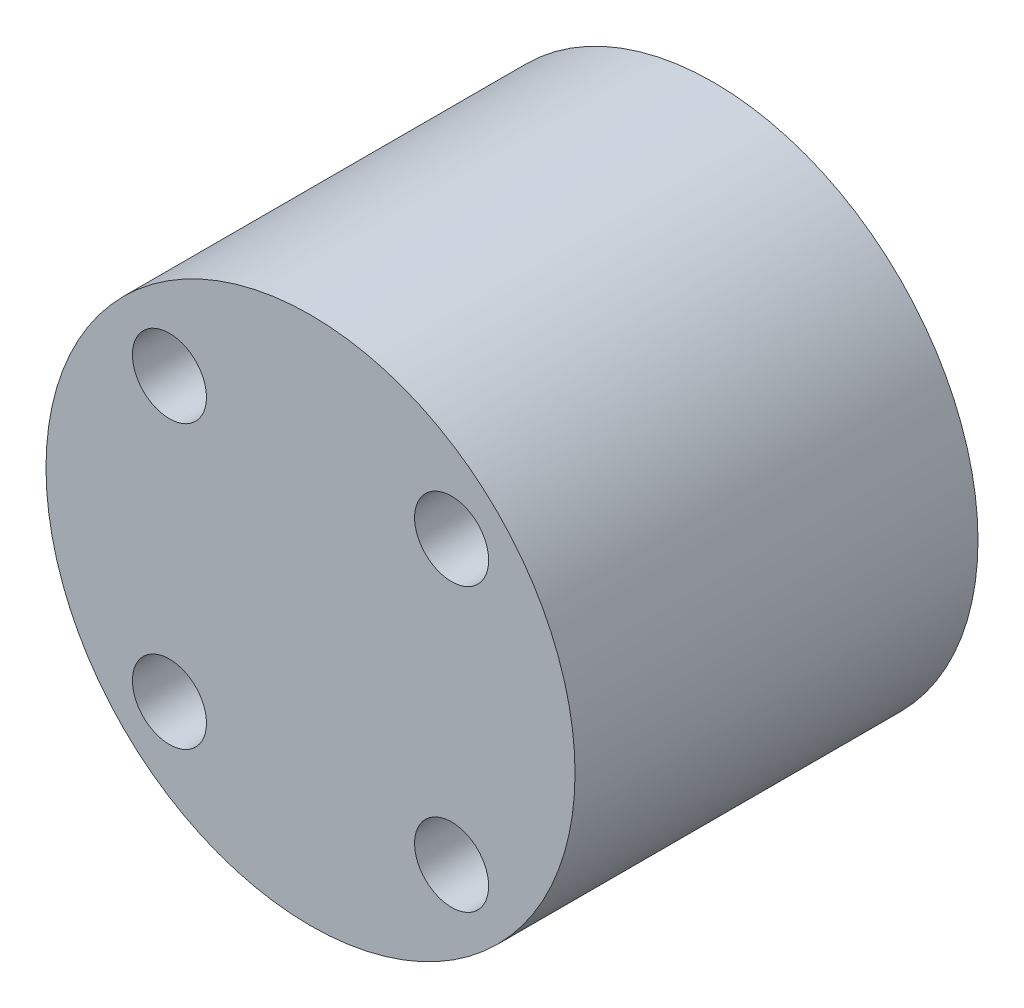
ISO-10303-21;
HEADER;
FILE_DESCRIPTION(('STEP AP214'),'2;1');
FILE_NAME('part.step','',(''),(''),'','','');
FILE_SCHEMA(('AUTOMOTIVE_DESIGN { 1 0 10303 214 1 1 1 1 }'));
ENDSEC;
DATA;
#1=APPLICATION_CONTEXT('core data for automotive mechanical design processes');
#2=APPLICATION_PROTOCOL_DEFINITION('international standard','automotive_design',2000,#1);
#3=PRODUCT_CONTEXT('',#1,'mechanical');
#4=PRODUCT('Part','Part','',(#3));
#5=PRODUCT_RELATED_PRODUCT_CATEGORY('part','',(#4));
#6=PRODUCT_DEFINITION_FORMATION('','',#4);
#7=PRODUCT_DEFINITION_CONTEXT('part definition',#1,'design');
#8=PRODUCT_DEFINITION('design','',#6,#7);
#9=PRODUCT_DEFINITION_SHAPE('','',#8);
#10=(LENGTH_UNIT() NAMED_UNIT(*) SI_UNIT(.MILLI.,.METRE.));
#11=(NAMED_UNIT(*) PLANE_ANGLE_UNIT() SI_UNIT($,.RADIAN.));
#12=(NAMED_UNIT(*) SI_UNIT($,.STERADIAN.) SOLID_ANGLE_UNIT());
#13=UNCERTAINTY_MEASURE_WITH_UNIT(LENGTH_MEASURE(1.E-05),#10,'distance_accuracy_value','');
#14=(GEOMETRIC_REPRESENTATION_CONTEXT(3) GLOBAL_UNCERTAINTY_ASSIGNED_CONTEXT((#13)) GLOBAL_UNIT_ASSIGNED_CONTEXT((#10,
#11,#12)) REPRESENTATION_CONTEXT('',''));
#15=CARTESIAN_POINT('',(0.,0.,0.));
#16=DIRECTION('',(0.,0.,1.));
#17=DIRECTION('',(1.,0.,0.));
#18=AXIS2_PLACEMENT_3D('',#15,#16,#17);
#19=CARTESIAN_POINT('',(0.,0.,11.425));
#20=DIRECTION('',(0.,0.,-1.));
#21=DIRECTION('',(-1.,0.,0.));
#22=AXIS2_PLACEMENT_3D('',#19,#20,#21);
#23=CYLINDRICAL_SURFACE('',#22,15.);
#24=CARTESIAN_POINT('',(0.,0.,11.425));
#25=DIRECTION('',(0.,0.,1.));
#26=DIRECTION('',(1.,0.,0.));
#27=AXIS2_PLACEMENT_3D('',#24,#25,#26);
#28=CIRCLE('',#27,15.);
#29=CARTESIAN_POINT('',(-15.,0.,11.425));
#30=VERTEX_POINT('',#29);
#31=EDGE_CURVE('E10',#30,#30,#28,.T.);
#32=CARTESIAN_POINT('',(0.,0.,-11.425));
#33=DIRECTION('',(0.,0.,1.));
#34=DIRECTION('',(1.,0.,0.));
#35=AXIS2_PLACEMENT_3D('',#32,#33,#34);
#36=CIRCLE('',#35,15.);
#37=CARTESIAN_POINT('',(-15.,0.,-11.425));
#38=VERTEX_POINT('',#37);
#39=EDGE_CURVE('E37',#38,#38,#36,.T.);
#40=CARTESIAN_POINT('',(-15.,0.,11.425));
#41=CARTESIAN_POINT('',(-15.,0.,11.1869791666667));
#42=CARTESIAN_POINT('',(-15.,0.,10.9489583333333));
#43=CARTESIAN_POINT('',(-15.,0.,10.4729166666667));
#44=CARTESIAN_POINT('',(-15.,0.,10.2348958333333));
#45=CARTESIAN_POINT('',(-15.,0.,9.75885416666667));
#46=CARTESIAN_POINT('',(-15.,0.,9.52083333333333));
#47=CARTESIAN_POINT('',(-15.,0.,9.04479166666667));
#48=CARTESIAN_POINT('',(-15.,0.,8.80677083333333));
#49=CARTESIAN_POINT('',(-15.,0.,8.33072916666667));
#50=CARTESIAN_POINT('',(-15.,0.,8.09270833333333));
#51=CARTESIAN_POINT('',(-15.,0.,7.61666666666667));
#52=CARTESIAN_POINT('',(-15.,0.,7.37864583333333));
#53=CARTESIAN_POINT('',(-15.,0.,6.90260416666667));
#54=CARTESIAN_POINT('',(-15.,0.,6.66458333333333));
#55=CARTESIAN_POINT('',(-15.,0.,6.18854166666667));
#56=CARTESIAN_POINT('',(-15.,0.,5.95052083333333));
#57=CARTESIAN_POINT('',(-15.,0.,5.47447916666667));
#58=CARTESIAN_POINT('',(-15.,0.,5.23645833333333));
#59=CARTESIAN_POINT('',(-15.,0.,4.76041666666667));
#60=CARTESIAN_POINT('',(-15.,0.,4.52239583333333));
#61=CARTESIAN_POINT('',(-15.,0.,4.04635416666667));
#62=CARTESIAN_POINT('',(-15.,0.,3.80833333333333));
#63=CARTESIAN_POINT('',(-15.,0.,3.33229166666667));
#64=CARTESIAN_POINT('',(-15.,0.,3.09427083333333));
#65=CARTESIAN_POINT('',(-15.,0.,2.61822916666666));
#66=CARTESIAN_POINT('',(-15.,0.,2.38020833333333));
#67=CARTESIAN_POINT('',(-15.,0.,1.90416666666666));
#68=CARTESIAN_POINT('',(-15.,0.,1.66614583333333));
#69=CARTESIAN_POINT('',(-15.,0.,1.19010416666666));
#70=CARTESIAN_POINT('',(-15.,0.,0.952083333333331));
#71=CARTESIAN_POINT('',(-15.,0.,0.476041666666664));
#72=CARTESIAN_POINT('',(-15.,0.,0.23802083333333));
#73=CARTESIAN_POINT('',(-15.,0.,-0.238020833333337));
#74=CARTESIAN_POINT('',(-15.,0.,-0.476041666666671));
#75=CARTESIAN_POINT('',(-15.,0.,-0.952083333333338));
#76=CARTESIAN_POINT('',(-15.,0.,-1.19010416666667));
#77=CARTESIAN_POINT('',(-15.,0.,-1.66614583333334));
#78=CARTESIAN_POINT('',(-15.,0.,-1.90416666666667));
#79=CARTESIAN_POINT('',(-15.,0.,-2.38020833333334));
#80=CARTESIAN_POINT('',(-15.,0.,-2.61822916666667));
#81=CARTESIAN_POINT('',(-15.,0.,-3.09427083333334));
#82=CARTESIAN_POINT('',(-15.,0.,-3.33229166666667));
#83=CARTESIAN_POINT('',(-15.,0.,-3.80833333333334));
#84=CARTESIAN_POINT('',(-15.,0.,-4.04635416666667));
#85=CARTESIAN_POINT('',(-15.,0.,-4.52239583333333));
#86=CARTESIAN_POINT('',(-15.,0.,-4.76041666666667));
#87=CARTESIAN_POINT('',(-15.,0.,-5.23645833333333));
#88=CARTESIAN_POINT('',(-15.,0.,-5.47447916666667));
#89=CARTESIAN_POINT('',(-15.,0.,-5.95052083333334));
#90=CARTESIAN_POINT('',(-15.,0.,-6.18854166666667));
#91=CARTESIAN_POINT('',(-15.,0.,-6.66458333333334));
#92=CARTESIAN_POINT('',(-15.,0.,-6.90260416666667));
#93=CARTESIAN_POINT('',(-15.,0.,-7.37864583333334));
#94=CARTESIAN_POINT('',(-15.,0.,-7.61666666666667));
#95=CARTESIAN_POINT('',(-15.,0.,-8.09270833333334));
#96=CARTESIAN_POINT('',(-15.,0.,-8.33072916666667));
#97=CARTESIAN_POINT('',(-15.,0.,-8.80677083333334));
#98=CARTESIAN_POINT('',(-15.,0.,-9.04479166666667));
#99=CARTESIAN_POINT('',(-15.,0.,-9.52083333333334));
#100=CARTESIAN_POINT('',(-15.,0.,-9.75885416666667));
#101=CARTESIAN_POINT('',(-15.,0.,-10.2348958333333));
#102=CARTESIAN_POINT('',(-15.,0.,-10.4729166666667));
#103=CARTESIAN_POINT('',(-15.,0.,-10.9489583333333));
#104=CARTESIAN_POINT('',(-15.,0.,-11.1869791666667));
#105=CARTESIAN_POINT('',(-15.,0.,-11.425));
#106=B_SPLINE_CURVE_WITH_KNOTS('',3,(#40,#41,#42,#43,#44,#45,#46,#47,#48,#49,#50,#51,#52,#53,
#54,#55,#56,#57,#58,#59,#60,#61,#62,#63,#64,#65,#66,#67,#68,#69,#70,#71,#72,#73,#74,#75,#76,#77,
#78,#79,#80,#81,#82,#83,#84,#85,#86,#87,#88,#89,#90,#91,#92,#93,#94,#95,#96,#97,#98,#99,#100,
#101,#102,#103,#104,#105),.UNSPECIFIED.,.F.,.F.,(4,2,2,2,2,2,2,2,2,2,2,2,2,2,2,2,2,2,2,2,2,2,2,
2,2,2,2,2,2,2,2,2,4),(0.,0.714062499999999,1.428125,2.1421875,2.85625,3.5703125,4.284375,
4.9984375,5.7125,6.4265625,7.140625,7.8546875,8.56875,9.2828125,9.996875,10.7109375,11.425,
12.1390625,12.853125,13.5671875,14.28125,14.9953125,15.709375,16.4234375,17.1375,17.8515625,
18.565625,19.2796875,19.99375,20.7078125,21.421875,22.1359375,22.85),.UNSPECIFIED.);
#107=EDGE_CURVE('BSEAM40',#30,#38,#106,.T.);
#108=ORIENTED_EDGE('',*,*,#31,.F.);
#109=ORIENTED_EDGE('',*,*,#39,.T.);
#110=ORIENTED_EDGE('',*,*,#107,.T.);
#111=ORIENTED_EDGE('',*,*,#107,.F.);
#112=EDGE_LOOP('',(#108,#110,#109,#111));
#113=FACE_BOUND('',#112,.T.);
#114=ADVANCED_FACE('F40',(#113),#23,.T.);
#115=CARTESIAN_POINT('',(0.,0.,11.425));
#116=DIRECTION('',(0.,0.,1.));
#117=DIRECTION('',(1.,0.,0.));
#118=AXIS2_PLACEMENT_3D('',#115,#116,#117);
#119=PLANE('',#118);
#120=CARTESIAN_POINT('',(-8.,-8.,11.425));
#121=DIRECTION('',(0.,0.,1.));
#122=DIRECTION('',(1.,0.,0.));
#123=AXIS2_PLACEMENT_3D('',#120,#121,#122);
#124=CIRCLE('',#123,2.1);
#125=CARTESIAN_POINT('',(-5.9,-8.,11.425));
#126=VERTEX_POINT('',#125);
#127=EDGE_CURVE('E59',#126,#126,#124,.T.);
#128=ORIENTED_EDGE('',*,*,#127,.F.);
#129=EDGE_LOOP('',(#128));
#130=FACE_BOUND('',#129,.T.);
#131=CARTESIAN_POINT('',(8.,-8.,11.425));
#132=DIRECTION('',(0.,0.,1.));
#133=DIRECTION('',(1.,0.,0.));
#134=AXIS2_PLACEMENT_3D('',#131,#132,#133);
#135=CIRCLE('',#134,2.1);
#136=CARTESIAN_POINT('',(10.1,-8.,11.425));
#137=VERTEX_POINT('',#136);
#138=EDGE_CURVE('E61',#137,#137,#135,.T.);
#139=ORIENTED_EDGE('',*,*,#138,.F.);
#140=EDGE_LOOP('',(#139));
#141=FACE_BOUND('',#140,.T.);
#142=CARTESIAN_POINT('',(8.,8.,11.425));
#143=DIRECTION('',(0.,0.,1.));
#144=DIRECTION('',(1.,0.,0.));
#145=AXIS2_PLACEMENT_3D('',#142,#143,#144);
#146=CIRCLE('',#145,2.1);
#147=CARTESIAN_POINT('',(10.1,8.,11.425));
#148=VERTEX_POINT('',#147);
#149=EDGE_CURVE('E55',#148,#148,#146,.T.);
#150=ORIENTED_EDGE('',*,*,#149,.F.);
#151=EDGE_LOOP('',(#150));
#152=FACE_BOUND('',#151,.T.);
#153=CARTESIAN_POINT('',(-8.,8.,11.425));
#154=DIRECTION('',(0.,0.,1.));
#155=DIRECTION('',(1.,0.,0.));
#156=AXIS2_PLACEMENT_3D('',#153,#154,#155);
#157=CIRCLE('',#156,2.1);
#158=CARTESIAN_POINT('',(-5.9,8.,11.425));
#159=VERTEX_POINT('',#158);
#160=EDGE_CURVE('E47',#159,#159,#157,.T.);
#161=ORIENTED_EDGE('',*,*,#160,.F.);
#162=EDGE_LOOP('',(#161));
#163=FACE_BOUND('',#162,.T.);
#164=ORIENTED_EDGE('',*,*,#31,.T.);
#165=EDGE_LOOP('',(#164));
#166=FACE_BOUND('',#165,.T.);
#167=ADVANCED_FACE('F73',(#130,#141,#152,#163,#166),#119,.T.);
#168=CARTESIAN_POINT('',(0.,0.,-11.425));
#169=DIRECTION('',(0.,0.,1.));
#170=DIRECTION('',(1.,0.,0.));
#171=AXIS2_PLACEMENT_3D('',#168,#169,#170);
#172=PLANE('',#171);
#173=CARTESIAN_POINT('',(-8.,-8.,-11.425));
#174=DIRECTION('',(0.,0.,1.));
#175=DIRECTION('',(1.,0.,0.));
#176=AXIS2_PLACEMENT_3D('',#173,#174,#175);
#177=CIRCLE('',#176,2.1);
#178=CARTESIAN_POINT('',(-5.9,-8.,-11.425));
#179=VERTEX_POINT('',#178);
#180=EDGE_CURVE('E54',#179,#179,#177,.T.);
#181=ORIENTED_EDGE('',*,*,#180,.T.);
#182=EDGE_LOOP('',(#181));
#183=FACE_BOUND('',#182,.T.);
#184=CARTESIAN_POINT('',(8.,-8.,-11.425));
#185=DIRECTION('',(0.,0.,1.));
#186=DIRECTION('',(1.,0.,0.));
#187=AXIS2_PLACEMENT_3D('',#184,#185,#186);
#188=CIRCLE('',#187,2.1);
#189=CARTESIAN_POINT('',(10.1,-8.,-11.425));
#190=VERTEX_POINT('',#189);
#191=EDGE_CURVE('E62',#190,#190,#188,.T.);
#192=ORIENTED_EDGE('',*,*,#191,.T.);
#193=EDGE_LOOP('',(#192));
#194=FACE_BOUND('',#193,.T.);
#195=CARTESIAN_POINT('',(8.,8.,-11.425));
#196=DIRECTION('',(0.,0.,1.));
#197=DIRECTION('',(1.,0.,0.));
#198=AXIS2_PLACEMENT_3D('',#195,#196,#197);
#199=CIRCLE('',#198,2.1);
#200=CARTESIAN_POINT('',(10.1,8.,-11.425));
#201=VERTEX_POINT('',#200);
#202=EDGE_CURVE('E67',#201,#201,#199,.T.);
#203=ORIENTED_EDGE('',*,*,#202,.T.);
#204=EDGE_LOOP('',(#203));
#205=FACE_BOUND('',#204,.T.);
#206=CARTESIAN_POINT('',(-8.,8.,-11.425));
#207=DIRECTION('',(0.,0.,1.));
#208=DIRECTION('',(1.,0.,0.));
#209=AXIS2_PLACEMENT_3D('',#206,#207,#208);
#210=CIRCLE('',#209,2.1);
#211=CARTESIAN_POINT('',(-5.9,8.,-11.425));
#212=VERTEX_POINT('',#211);
#213=EDGE_CURVE('E50',#212,#212,#210,.T.);
#214=ORIENTED_EDGE('',*,*,#213,.T.);
#215=EDGE_LOOP('',(#214));
#216=FACE_BOUND('',#215,.T.);
#217=ORIENTED_EDGE('',*,*,#39,.F.);
#218=EDGE_LOOP('',(#217));
#219=FACE_BOUND('',#218,.T.);
#220=ADVANCED_FACE('F79',(#183,#194,#205,#216,#219),#172,.F.);
#221=CARTESIAN_POINT('',(-8.,8.,-11.425));
#222=DIRECTION('',(0.,0.,1.));
#223=DIRECTION('',(1.,0.,0.));
#224=AXIS2_PLACEMENT_3D('',#221,#222,#223);
#225=CYLINDRICAL_SURFACE('',#224,2.1);
#226=CARTESIAN_POINT('',(-5.9,8.,-11.425));
#227=CARTESIAN_POINT('',(-5.9,8.,-11.1869791666667));
#228=CARTESIAN_POINT('',(-5.9,8.,-10.9489583333333));
#229=CARTESIAN_POINT('',(-5.9,8.,-10.4729166666667));
#230=CARTESIAN_POINT('',(-5.9,8.,-10.2348958333333));
#231=CARTESIAN_POINT('',(-5.9,8.,-9.75885416666667));
#232=CARTESIAN_POINT('',(-5.9,8.,-9.52083333333334));
#233=CARTESIAN_POINT('',(-5.9,8.,-9.04479166666667));
#234=CARTESIAN_POINT('',(-5.9,8.,-8.80677083333333));
#235=CARTESIAN_POINT('',(-5.9,8.,-8.33072916666667));
#236=CARTESIAN_POINT('',(-5.9,8.,-8.09270833333334));
#237=CARTESIAN_POINT('',(-5.9,8.,-7.61666666666667));
#238=CARTESIAN_POINT('',(-5.9,8.,-7.37864583333334));
#239=CARTESIAN_POINT('',(-5.9,8.,-6.90260416666667));
#240=CARTESIAN_POINT('',(-5.9,8.,-6.66458333333334));
#241=CARTESIAN_POINT('',(-5.9,8.,-6.18854166666667));
#242=CARTESIAN_POINT('',(-5.9,8.,-5.95052083333334));
#243=CARTESIAN_POINT('',(-5.9,8.,-5.47447916666667));
#244=CARTESIAN_POINT('',(-5.9,8.,-5.23645833333333));
#245=CARTESIAN_POINT('',(-5.9,8.,-4.76041666666667));
#246=CARTESIAN_POINT('',(-5.9,8.,-4.52239583333334));
#247=CARTESIAN_POINT('',(-5.9,8.,-4.04635416666667));
#248=CARTESIAN_POINT('',(-5.9,8.,-3.80833333333334));
#249=CARTESIAN_POINT('',(-5.9,8.,-3.33229166666667));
#250=CARTESIAN_POINT('',(-5.9,8.,-3.09427083333334));
#251=CARTESIAN_POINT('',(-5.9,8.,-2.61822916666667));
#252=CARTESIAN_POINT('',(-5.9,8.,-2.38020833333334));
#253=CARTESIAN_POINT('',(-5.9,8.,-1.90416666666667));
#254=CARTESIAN_POINT('',(-5.9,8.,-1.66614583333334));
#255=CARTESIAN_POINT('',(-5.9,8.,-1.19010416666667));
#256=CARTESIAN_POINT('',(-5.9,8.,-0.952083333333335));
#257=CARTESIAN_POINT('',(-5.9,8.,-0.476041666666668));
#258=CARTESIAN_POINT('',(-5.9,8.,-0.238020833333335));
#259=CARTESIAN_POINT('',(-5.9,8.,0.238020833333331));
#260=CARTESIAN_POINT('',(-5.9,8.,0.476041666666664));
#261=CARTESIAN_POINT('',(-5.9,8.,0.952083333333332));
#262=CARTESIAN_POINT('',(-5.9,8.,1.19010416666667));
#263=CARTESIAN_POINT('',(-5.9,8.,1.66614583333333));
#264=CARTESIAN_POINT('',(-5.9,8.,1.90416666666667));
#265=CARTESIAN_POINT('',(-5.9,8.,2.38020833333333));
#266=CARTESIAN_POINT('',(-5.9,8.,2.61822916666667));
#267=CARTESIAN_POINT('',(-5.9,8.,3.09427083333333));
#268=CARTESIAN_POINT('',(-5.9,8.,3.33229166666667));
#269=CARTESIAN_POINT('',(-5.9,8.,3.80833333333333));
#270=CARTESIAN_POINT('',(-5.9,8.,4.04635416666666));
#271=CARTESIAN_POINT('',(-5.9,8.,4.52239583333333));
#272=CARTESIAN_POINT('',(-5.9,8.,4.76041666666666));
#273=CARTESIAN_POINT('',(-5.9,8.,5.23645833333333));
#274=CARTESIAN_POINT('',(-5.9,8.,5.47447916666666));
#275=CARTESIAN_POINT('',(-5.9,8.,5.95052083333333));
#276=CARTESIAN_POINT('',(-5.9,8.,6.18854166666666));
#277=CARTESIAN_POINT('',(-5.9,8.,6.66458333333333));
#278=CARTESIAN_POINT('',(-5.9,8.,6.90260416666666));
#279=CARTESIAN_POINT('',(-5.9,8.,7.37864583333333));
#280=CARTESIAN_POINT('',(-5.9,8.,7.61666666666666));
#281=CARTESIAN_POINT('',(-5.9,8.,8.09270833333333));
#282=CARTESIAN_POINT('',(-5.9,8.,8.33072916666666));
#283=CARTESIAN_POINT('',(-5.9,8.,8.80677083333333));
#284=CARTESIAN_POINT('',(-5.9,8.,9.04479166666667));
#285=CARTESIAN_POINT('',(-5.9,8.,9.52083333333333));
#286=CARTESIAN_POINT('',(-5.9,8.,9.75885416666667));
#287=CARTESIAN_POINT('',(-5.9,8.,10.2348958333333));
#288=CARTESIAN_POINT('',(-5.9,8.,10.4729166666667));
#289=CARTESIAN_POINT('',(-5.9,8.,10.9489583333333));
#290=CARTESIAN_POINT('',(-5.9,8.,11.1869791666667));
#291=CARTESIAN_POINT('',(-5.9,8.,11.425));
#292=B_SPLINE_CURVE_WITH_KNOTS('',3,(#226,#227,#228,#229,#230,#231,#232,#233,#234,#235,#236,
#237,#238,#239,#240,#241,#242,#243,#244,#245,#246,#247,#248,#249,#250,#251,#252,#253,#254,#255,
#256,#257,#258,#259,#260,#261,#262,#263,#264,#265,#266,#267,#268,#269,#270,#271,#272,#273,#274,
#275,#276,#277,#278,#279,#280,#281,#282,#283,#284,#285,#286,#287,#288,#289,#290,#291),
.UNSPECIFIED.,.F.,.F.,(4,2,2,2,2,2,2,2,2,2,2,2,2,2,2,2,2,2,2,2,2,2,2,2,2,2,2,2,2,2,2,2,4),(0.,
0.714062499999999,1.428125,2.1421875,2.85625,3.5703125,4.284375,4.9984375,5.7125,6.4265625,
7.140625,7.8546875,8.56875,9.2828125,9.996875,10.7109375,11.425,12.1390625,12.853125,13.5671875,
14.28125,14.9953125,15.709375,16.4234375,17.1375,17.8515625,18.565625,19.2796875,19.99375,
20.7078125,21.421875,22.1359375,22.85),.UNSPECIFIED.);
#293=EDGE_CURVE('BSEAM84',#212,#159,#292,.T.);
#294=ORIENTED_EDGE('',*,*,#213,.F.);
#295=ORIENTED_EDGE('',*,*,#160,.T.);
#296=ORIENTED_EDGE('',*,*,#293,.T.);
#297=ORIENTED_EDGE('',*,*,#293,.F.);
#298=EDGE_LOOP('',(#294,#296,#295,#297));
#299=FACE_BOUND('',#298,.T.);
#300=ADVANCED_FACE('F84',(#299),#225,.F.);
#301=CARTESIAN_POINT('',(8.,8.,-11.425));
#302=DIRECTION('',(0.,0.,1.));
#303=DIRECTION('',(1.,0.,0.));
#304=AXIS2_PLACEMENT_3D('',#301,#302,#303);
#305=CYLINDRICAL_SURFACE('',#304,2.1);
#306=CARTESIAN_POINT('',(10.1,8.,-11.425));
#307=CARTESIAN_POINT('',(10.1,8.,-11.1869791666667));
#308=CARTESIAN_POINT('',(10.1,8.,-10.9489583333333));
#309=CARTESIAN_POINT('',(10.1,8.,-10.4729166666667));
#310=CARTESIAN_POINT('',(10.1,8.,-10.2348958333333));
#311=CARTESIAN_POINT('',(10.1,8.,-9.75885416666667));
#312=CARTESIAN_POINT('',(10.1,8.,-9.52083333333334));
#313=CARTESIAN_POINT('',(10.1,8.,-9.04479166666667));
#314=CARTESIAN_POINT('',(10.1,8.,-8.80677083333333));
#315=CARTESIAN_POINT('',(10.1,8.,-8.33072916666667));
#316=CARTESIAN_POINT('',(10.1,8.,-8.09270833333334));
#317=CARTESIAN_POINT('',(10.1,8.,-7.61666666666667));
#318=CARTESIAN_POINT('',(10.1,8.,-7.37864583333334));
#319=CARTESIAN_POINT('',(10.1,8.,-6.90260416666667));
#320=CARTESIAN_POINT('',(10.1,8.,-6.66458333333334));
#321=CARTESIAN_POINT('',(10.1,8.,-6.18854166666667));
#322=CARTESIAN_POINT('',(10.1,8.,-5.95052083333334));
#323=CARTESIAN_POINT('',(10.1,8.,-5.47447916666667));
#324=CARTESIAN_POINT('',(10.1,8.,-5.23645833333333));
#325=CARTESIAN_POINT('',(10.1,8.,-4.76041666666667));
#326=CARTESIAN_POINT('',(10.1,8.,-4.52239583333334));
#327=CARTESIAN_POINT('',(10.1,8.,-4.04635416666667));
#328=CARTESIAN_POINT('',(10.1,8.,-3.80833333333334));
#329=CARTESIAN_POINT('',(10.1,8.,-3.33229166666667));
#330=CARTESIAN_POINT('',(10.1,8.,-3.09427083333334));
#331=CARTESIAN_POINT('',(10.1,8.,-2.61822916666667));
#332=CARTESIAN_POINT('',(10.1,8.,-2.38020833333334));
#333=CARTESIAN_POINT('',(10.1,8.,-1.90416666666667));
#334=CARTESIAN_POINT('',(10.1,8.,-1.66614583333334));
#335=CARTESIAN_POINT('',(10.1,8.,-1.19010416666667));
#336=CARTESIAN_POINT('',(10.1,8.,-0.952083333333335));
#337=CARTESIAN_POINT('',(10.1,8.,-0.476041666666668));
#338=CARTESIAN_POINT('',(10.1,8.,-0.238020833333335));
#339=CARTESIAN_POINT('',(10.1,8.,0.238020833333331));
#340=CARTESIAN_POINT('',(10.1,8.,0.476041666666664));
#341=CARTESIAN_POINT('',(10.1,8.,0.952083333333332));
#342=CARTESIAN_POINT('',(10.1,8.,1.19010416666667));
#343=CARTESIAN_POINT('',(10.1,8.,1.66614583333333));
#344=CARTESIAN_POINT('',(10.1,8.,1.90416666666667));
#345=CARTESIAN_POINT('',(10.1,8.,2.38020833333333));
#346=CARTESIAN_POINT('',(10.1,8.,2.61822916666667));
#347=CARTESIAN_POINT('',(10.1,8.,3.09427083333333));
#348=CARTESIAN_POINT('',(10.1,8.,3.33229166666667));
#349=CARTESIAN_POINT('',(10.1,8.,3.80833333333333));
#350=CARTESIAN_POINT('',(10.1,8.,4.04635416666666));
#351=CARTESIAN_POINT('',(10.1,8.,4.52239583333333));
#352=CARTESIAN_POINT('',(10.1,8.,4.76041666666666));
#353=CARTESIAN_POINT('',(10.1,8.,5.23645833333333));
#354=CARTESIAN_POINT('',(10.1,8.,5.47447916666666));
#355=CARTESIAN_POINT('',(10.1,8.,5.95052083333333));
#356=CARTESIAN_POINT('',(10.1,8.,6.18854166666666));
#357=CARTESIAN_POINT('',(10.1,8.,6.66458333333333));
#358=CARTESIAN_POINT('',(10.1,8.,6.90260416666666));
#359=CARTESIAN_POINT('',(10.1,8.,7.37864583333333));
#360=CARTESIAN_POINT('',(10.1,8.,7.61666666666666));
#361=CARTESIAN_POINT('',(10.1,8.,8.09270833333333));
#362=CARTESIAN_POINT('',(10.1,8.,8.33072916666666));
#363=CARTESIAN_POINT('',(10.1,8.,8.80677083333333));
#364=CARTESIAN_POINT('',(10.1,8.,9.04479166666667));
#365=CARTESIAN_POINT('',(10.1,8.,9.52083333333333));
#366=CARTESIAN_POINT('',(10.1,8.,9.75885416666667));
#367=CARTESIAN_POINT('',(10.1,8.,10.2348958333333));
#368=CARTESIAN_POINT('',(10.1,8.,10.4729166666667));
#369=CARTESIAN_POINT('',(10.1,8.,10.9489583333333));
#370=CARTESIAN_POINT('',(10.1,8.,11.1869791666667));
#371=CARTESIAN_POINT('',(10.1,8.,11.425));
#372=B_SPLINE_CURVE_WITH_KNOTS('',3,(#306,#307,#308,#309,#310,#311,#312,#313,#314,#315,#316,
#317,#318,#319,#320,#321,#322,#323,#324,#325,#326,#327,#328,#329,#330,#331,#332,#333,#334,#335,
#336,#337,#338,#339,#340,#341,#342,#343,#344,#345,#346,#347,#348,#349,#350,#351,#352,#353,#354,
#355,#356,#357,#358,#359,#360,#361,#362,#363,#364,#365,#366,#367,#368,#369,#370,#371),
.UNSPECIFIED.,.F.,.F.,(4,2,2,2,2,2,2,2,2,2,2,2,2,2,2,2,2,2,2,2,2,2,2,2,2,2,2,2,2,2,2,2,4),(0.,
0.714062499999999,1.428125,2.1421875,2.85625,3.5703125,4.284375,4.9984375,5.7125,6.4265625,
7.140625,7.8546875,8.56875,9.2828125,9.996875,10.7109375,11.425,12.1390625,12.853125,13.5671875,
14.28125,14.9953125,15.709375,16.4234375,17.1375,17.8515625,18.565625,19.2796875,19.99375,
20.7078125,21.421875,22.1359375,22.85),.UNSPECIFIED.);
#373=EDGE_CURVE('BSEAM71',#201,#148,#372,.T.);
#374=ORIENTED_EDGE('',*,*,#202,.F.);
#375=ORIENTED_EDGE('',*,*,#149,.T.);
#376=ORIENTED_EDGE('',*,*,#373,.T.);
#377=ORIENTED_EDGE('',*,*,#373,.F.);
#378=EDGE_LOOP('',(#374,#376,#375,#377));
#379=FACE_BOUND('',#378,.T.);
#380=ADVANCED_FACE('F71',(#379),#305,.F.);
#381=CARTESIAN_POINT('',(8.,-8.,-11.425));
#382=DIRECTION('',(0.,0.,1.));
#383=DIRECTION('',(1.,0.,0.));
#384=AXIS2_PLACEMENT_3D('',#381,#382,#383);
#385=CYLINDRICAL_SURFACE('',#384,2.1);
#386=CARTESIAN_POINT('',(10.1,-8.,-11.425));
#387=CARTESIAN_POINT('',(10.1,-8.,-11.1869791666667));
#388=CARTESIAN_POINT('',(10.1,-8.,-10.9489583333333));
#389=CARTESIAN_POINT('',(10.1,-8.,-10.4729166666667));
#390=CARTESIAN_POINT('',(10.1,-8.,-10.2348958333333));
#391=CARTESIAN_POINT('',(10.1,-8.,-9.75885416666667));
#392=CARTESIAN_POINT('',(10.1,-8.,-9.52083333333334));
#393=CARTESIAN_POINT('',(10.1,-8.,-9.04479166666667));
#394=CARTESIAN_POINT('',(10.1,-8.,-8.80677083333333));
#395=CARTESIAN_POINT('',(10.1,-8.,-8.33072916666667));
#396=CARTESIAN_POINT('',(10.1,-8.,-8.09270833333334));
#397=CARTESIAN_POINT('',(10.1,-8.,-7.61666666666667));
#398=CARTESIAN_POINT('',(10.1,-8.,-7.37864583333334));
#399=CARTESIAN_POINT('',(10.1,-8.,-6.90260416666667));
#400=CARTESIAN_POINT('',(10.1,-8.,-6.66458333333334));
#401=CARTESIAN_POINT('',(10.1,-8.,-6.18854166666667));
#402=CARTESIAN_POINT('',(10.1,-8.,-5.95052083333334));
#403=CARTESIAN_POINT('',(10.1,-8.,-5.47447916666667));
#404=CARTESIAN_POINT('',(10.1,-8.,-5.23645833333333));
#405=CARTESIAN_POINT('',(10.1,-8.,-4.76041666666667));
#406=CARTESIAN_POINT('',(10.1,-8.,-4.52239583333334));
#407=CARTESIAN_POINT('',(10.1,-8.,-4.04635416666667));
#408=CARTESIAN_POINT('',(10.1,-8.,-3.80833333333334));
#409=CARTESIAN_POINT('',(10.1,-8.,-3.33229166666667));
#410=CARTESIAN_POINT('',(10.1,-8.,-3.09427083333334));
#411=CARTESIAN_POINT('',(10.1,-8.,-2.61822916666667));
#412=CARTESIAN_POINT('',(10.1,-8.,-2.38020833333334));
#413=CARTESIAN_POINT('',(10.1,-8.,-1.90416666666667));
#414=CARTESIAN_POINT('',(10.1,-8.,-1.66614583333334));
#415=CARTESIAN_POINT('',(10.1,-8.,-1.19010416666667));
#416=CARTESIAN_POINT('',(10.1,-8.,-0.952083333333335));
#417=CARTESIAN_POINT('',(10.1,-8.,-0.476041666666668));
#418=CARTESIAN_POINT('',(10.1,-8.,-0.238020833333335));
#419=CARTESIAN_POINT('',(10.1,-8.,0.238020833333331));
#420=CARTESIAN_POINT('',(10.1,-8.,0.476041666666664));
#421=CARTESIAN_POINT('',(10.1,-8.,0.952083333333332));
#422=CARTESIAN_POINT('',(10.1,-8.,1.19010416666667));
#423=CARTESIAN_POINT('',(10.1,-8.,1.66614583333333));
#424=CARTESIAN_POINT('',(10.1,-8.,1.90416666666667));
#425=CARTESIAN_POINT('',(10.1,-8.,2.38020833333333));
#426=CARTESIAN_POINT('',(10.1,-8.,2.61822916666667));
#427=CARTESIAN_POINT('',(10.1,-8.,3.09427083333333));
#428=CARTESIAN_POINT('',(10.1,-8.,3.33229166666667));
#429=CARTESIAN_POINT('',(10.1,-8.,3.80833333333333));
#430=CARTESIAN_POINT('',(10.1,-8.,4.04635416666666));
#431=CARTESIAN_POINT('',(10.1,-8.,4.52239583333333));
#432=CARTESIAN_POINT('',(10.1,-8.,4.76041666666666));
#433=CARTESIAN_POINT('',(10.1,-8.,5.23645833333333));
#434=CARTESIAN_POINT('',(10.1,-8.,5.47447916666666));
#435=CARTESIAN_POINT('',(10.1,-8.,5.95052083333333));
#436=CARTESIAN_POINT('',(10.1,-8.,6.18854166666666));
#437=CARTESIAN_POINT('',(10.1,-8.,6.66458333333333));
#438=CARTESIAN_POINT('',(10.1,-8.,6.90260416666666));
#439=CARTESIAN_POINT('',(10.1,-8.,7.37864583333333));
#440=CARTESIAN_POINT('',(10.1,-8.,7.61666666666666));
#441=CARTESIAN_POINT('',(10.1,-8.,8.09270833333333));
#442=CARTESIAN_POINT('',(10.1,-8.,8.33072916666666));
#443=CARTESIAN_POINT('',(10.1,-8.,8.80677083333333));
#444=CARTESIAN_POINT('',(10.1,-8.,9.04479166666667));
#445=CARTESIAN_POINT('',(10.1,-8.,9.52083333333333));
#446=CARTESIAN_POINT('',(10.1,-8.,9.75885416666667));
#447=CARTESIAN_POINT('',(10.1,-8.,10.2348958333333));
#448=CARTESIAN_POINT('',(10.1,-8.,10.4729166666667));
#449=CARTESIAN_POINT('',(10.1,-8.,10.9489583333333));
#450=CARTESIAN_POINT('',(10.1,-8.,11.1869791666667));
#451=CARTESIAN_POINT('',(10.1,-8.,11.425));
#452=B_SPLINE_CURVE_WITH_KNOTS('',3,(#386,#387,#388,#389,#390,#391,#392,#393,#394,#395,#396,
#397,#398,#399,#400,#401,#402,#403,#404,#405,#406,#407,#408,#409,#410,#411,#412,#413,#414,#415,
#416,#417,#418,#419,#420,#421,#422,#423,#424,#425,#426,#427,#428,#429,#430,#431,#432,#433,#434,
#435,#436,#437,#438,#439,#440,#441,#442,#443,#444,#445,#446,#447,#448,#449,#450,#451),
.UNSPECIFIED.,.F.,.F.,(4,2,2,2,2,2,2,2,2,2,2,2,2,2,2,2,2,2,2,2,2,2,2,2,2,2,2,2,2,2,2,2,4),(0.,
0.714062499999999,1.428125,2.1421875,2.85625,3.5703125,4.284375,4.9984375,5.7125,6.4265625,
7.140625,7.8546875,8.56875,9.2828125,9.996875,10.7109375,11.425,12.1390625,12.853125,13.5671875,
14.28125,14.9953125,15.709375,16.4234375,17.1375,17.8515625,18.565625,19.2796875,19.99375,
20.7078125,21.421875,22.1359375,22.85),.UNSPECIFIED.);
#453=EDGE_CURVE('BSEAM93',#190,#137,#452,.T.);
#454=ORIENTED_EDGE('',*,*,#191,.F.);
#455=ORIENTED_EDGE('',*,*,#138,.T.);
#456=ORIENTED_EDGE('',*,*,#453,.T.);
#457=ORIENTED_EDGE('',*,*,#453,.F.);
#458=EDGE_LOOP('',(#454,#456,#455,#457));
#459=FACE_BOUND('',#458,.T.);
#460=ADVANCED_FACE('F93',(#459),#385,.F.);
#461=CARTESIAN_POINT('',(-8.,-8.,-11.425));
#462=DIRECTION('',(0.,0.,1.));
#463=DIRECTION('',(1.,0.,0.));
#464=AXIS2_PLACEMENT_3D('',#461,#462,#463);
#465=CYLINDRICAL_SURFACE('',#464,2.1);
#466=CARTESIAN_POINT('',(-5.9,-8.,-11.425));
#467=CARTESIAN_POINT('',(-5.9,-8.,-11.1869791666667));
#468=CARTESIAN_POINT('',(-5.9,-8.,-10.9489583333333));
#469=CARTESIAN_POINT('',(-5.9,-8.,-10.4729166666667));
#470=CARTESIAN_POINT('',(-5.9,-8.,-10.2348958333333));
#471=CARTESIAN_POINT('',(-5.9,-8.,-9.75885416666667));
#472=CARTESIAN_POINT('',(-5.9,-8.,-9.52083333333334));
#473=CARTESIAN_POINT('',(-5.9,-8.,-9.04479166666667));
#474=CARTESIAN_POINT('',(-5.9,-8.,-8.80677083333333));
#475=CARTESIAN_POINT('',(-5.9,-8.,-8.33072916666667));
#476=CARTESIAN_POINT('',(-5.9,-8.,-8.09270833333334));
#477=CARTESIAN_POINT('',(-5.9,-8.,-7.61666666666667));
#478=CARTESIAN_POINT('',(-5.9,-8.,-7.37864583333334));
#479=CARTESIAN_POINT('',(-5.9,-8.,-6.90260416666667));
#480=CARTESIAN_POINT('',(-5.9,-8.,-6.66458333333334));
#481=CARTESIAN_POINT('',(-5.9,-8.,-6.18854166666667));
#482=CARTESIAN_POINT('',(-5.9,-8.,-5.95052083333334));
#483=CARTESIAN_POINT('',(-5.9,-8.,-5.47447916666667));
#484=CARTESIAN_POINT('',(-5.9,-8.,-5.23645833333333));
#485=CARTESIAN_POINT('',(-5.9,-8.,-4.76041666666667));
#486=CARTESIAN_POINT('',(-5.9,-8.,-4.52239583333334));
#487=CARTESIAN_POINT('',(-5.9,-8.,-4.04635416666667));
#488=CARTESIAN_POINT('',(-5.9,-8.,-3.80833333333334));
#489=CARTESIAN_POINT('',(-5.9,-8.,-3.33229166666667));
#490=CARTESIAN_POINT('',(-5.9,-8.,-3.09427083333334));
#491=CARTESIAN_POINT('',(-5.9,-8.,-2.61822916666667));
#492=CARTESIAN_POINT('',(-5.9,-8.,-2.38020833333334));
#493=CARTESIAN_POINT('',(-5.9,-8.,-1.90416666666667));
#494=CARTESIAN_POINT('',(-5.9,-8.,-1.66614583333334));
#495=CARTESIAN_POINT('',(-5.9,-8.,-1.19010416666667));
#496=CARTESIAN_POINT('',(-5.9,-8.,-0.952083333333335));
#497=CARTESIAN_POINT('',(-5.9,-8.,-0.476041666666668));
#498=CARTESIAN_POINT('',(-5.9,-8.,-0.238020833333335));
#499=CARTESIAN_POINT('',(-5.9,-8.,0.238020833333331));
#500=CARTESIAN_POINT('',(-5.9,-8.,0.476041666666664));
#501=CARTESIAN_POINT('',(-5.9,-8.,0.952083333333332));
#502=CARTESIAN_POINT('',(-5.9,-8.,1.19010416666667));
#503=CARTESIAN_POINT('',(-5.9,-8.,1.66614583333333));
#504=CARTESIAN_POINT('',(-5.9,-8.,1.90416666666667));
#505=CARTESIAN_POINT('',(-5.9,-8.,2.38020833333333));
#506=CARTESIAN_POINT('',(-5.9,-8.,2.61822916666667));
#507=CARTESIAN_POINT('',(-5.9,-8.,3.09427083333333));
#508=CARTESIAN_POINT('',(-5.9,-8.,3.33229166666667));
#509=CARTESIAN_POINT('',(-5.9,-8.,3.80833333333333));
#510=CARTESIAN_POINT('',(-5.9,-8.,4.04635416666666));
#511=CARTESIAN_POINT('',(-5.9,-8.,4.52239583333333));
#512=CARTESIAN_POINT('',(-5.9,-8.,4.76041666666666));
#513=CARTESIAN_POINT('',(-5.9,-8.,5.23645833333333));
#514=CARTESIAN_POINT('',(-5.9,-8.,5.47447916666666));
#515=CARTESIAN_POINT('',(-5.9,-8.,5.95052083333333));
#516=CARTESIAN_POINT('',(-5.9,-8.,6.18854166666666));
#517=CARTESIAN_POINT('',(-5.9,-8.,6.66458333333333));
#518=CARTESIAN_POINT('',(-5.9,-8.,6.90260416666666));
#519=CARTESIAN_POINT('',(-5.9,-8.,7.37864583333333));
#520=CARTESIAN_POINT('',(-5.9,-8.,7.61666666666666));
#521=CARTESIAN_POINT('',(-5.9,-8.,8.09270833333333));
#522=CARTESIAN_POINT('',(-5.9,-8.,8.33072916666666));
#523=CARTESIAN_POINT('',(-5.9,-8.,8.80677083333333));
#524=CARTESIAN_POINT('',(-5.9,-8.,9.04479166666667));
#525=CARTESIAN_POINT('',(-5.9,-8.,9.52083333333333));
#526=CARTESIAN_POINT('',(-5.9,-8.,9.75885416666667));
#527=CARTESIAN_POINT('',(-5.9,-8.,10.2348958333333));
#528=CARTESIAN_POINT('',(-5.9,-8.,10.4729166666667));
#529=CARTESIAN_POINT('',(-5.9,-8.,10.9489583333333));
#530=CARTESIAN_POINT('',(-5.9,-8.,11.1869791666667));
#531=CARTESIAN_POINT('',(-5.9,-8.,11.425));
#532=B_SPLINE_CURVE_WITH_KNOTS('',3,(#466,#467,#468,#469,#470,#471,#472,#473,#474,#475,#476,
#477,#478,#479,#480,#481,#482,#483,#484,#485,#486,#487,#488,#489,#490,#491,#492,#493,#494,#495,
#496,#497,#498,#499,#500,#501,#502,#503,#504,#505,#506,#507,#508,#509,#510,#511,#512,#513,#514,
#515,#516,#517,#518,#519,#520,#521,#522,#523,#524,#525,#526,#527,#528,#529,#530,#531),
.UNSPECIFIED.,.F.,.F.,(4,2,2,2,2,2,2,2,2,2,2,2,2,2,2,2,2,2,2,2,2,2,2,2,2,2,2,2,2,2,2,2,4),(0.,
0.714062499999999,1.428125,2.1421875,2.85625,3.5703125,4.284375,4.9984375,5.7125,6.4265625,
7.140625,7.8546875,8.56875,9.2828125,9.996875,10.7109375,11.425,12.1390625,12.853125,13.5671875,
14.28125,14.9953125,15.709375,16.4234375,17.1375,17.8515625,18.565625,19.2796875,19.99375,
20.7078125,21.421875,22.1359375,22.85),.UNSPECIFIED.);
#533=EDGE_CURVE('BSEAM131',#179,#126,#532,.T.);
#534=ORIENTED_EDGE('',*,*,#180,.F.);
#535=ORIENTED_EDGE('',*,*,#127,.T.);
#536=ORIENTED_EDGE('',*,*,#533,.T.);
#537=ORIENTED_EDGE('',*,*,#533,.F.);
#538=EDGE_LOOP('',(#534,#536,#535,#537));
#539=FACE_BOUND('',#538,.T.);
#540=ADVANCED_FACE('F131',(#539),#465,.F.);
#541=CLOSED_SHELL('',(#114,#167,#220,#300,#380,#460,#540));
#542=MANIFOLD_SOLID_BREP('B2',#541);
#543=ADVANCED_BREP_SHAPE_REPRESENTATION('',(#18,#542),#14);
#544=SHAPE_DEFINITION_REPRESENTATION(#9,#543);
ENDSEC;
END-ISO-10303-21;
